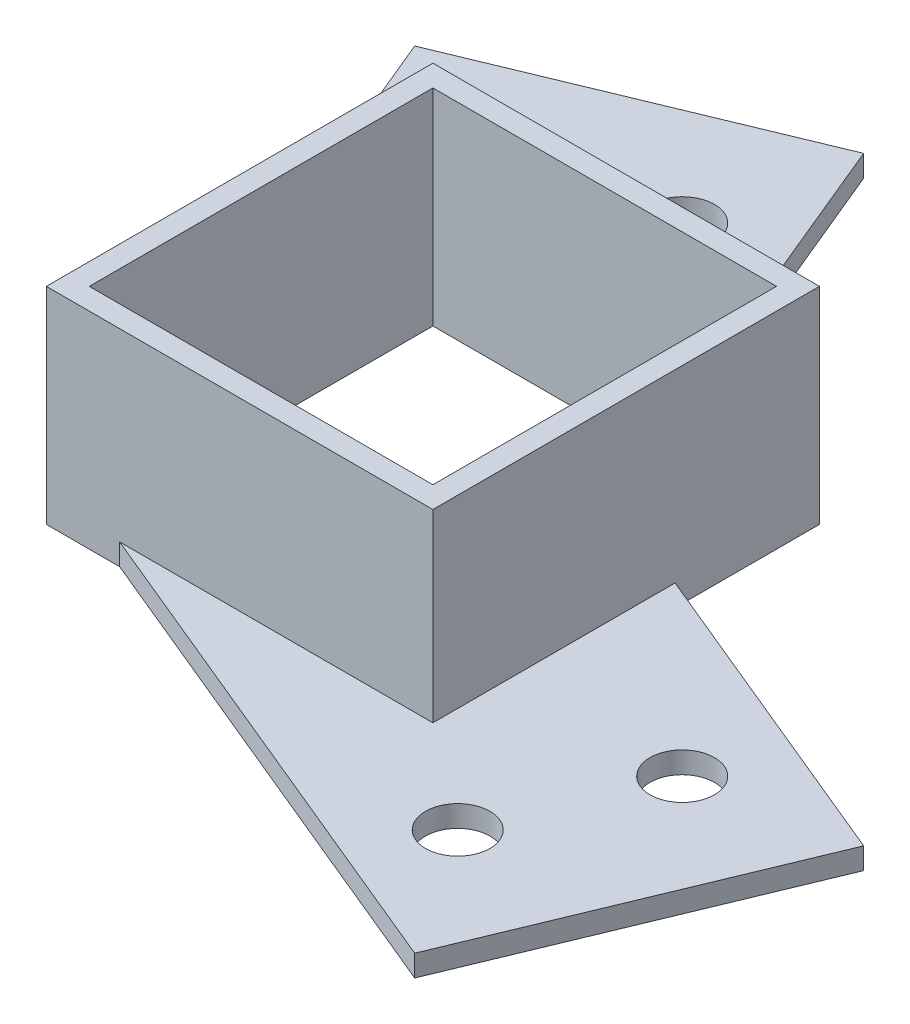
ISO-10303-21;
HEADER;
FILE_DESCRIPTION(('STEP AP214'),'2;1');
FILE_NAME('part.step','',(''),(''),'','','');
FILE_SCHEMA(('AUTOMOTIVE_DESIGN { 1 0 10303 214 1 1 1 1 }'));
ENDSEC;
DATA;
#1=APPLICATION_CONTEXT('core data for automotive mechanical design processes');
#2=APPLICATION_PROTOCOL_DEFINITION('international standard','automotive_design',2000,#1);
#3=PRODUCT_CONTEXT('',#1,'mechanical');
#4=PRODUCT('Part','Part','',(#3));
#5=PRODUCT_RELATED_PRODUCT_CATEGORY('part','',(#4));
#6=PRODUCT_DEFINITION_FORMATION('','',#4);
#7=PRODUCT_DEFINITION_CONTEXT('part definition',#1,'design');
#8=PRODUCT_DEFINITION('design','',#6,#7);
#9=PRODUCT_DEFINITION_SHAPE('','',#8);
#10=(LENGTH_UNIT() NAMED_UNIT(*) SI_UNIT(.MILLI.,.METRE.));
#11=(NAMED_UNIT(*) PLANE_ANGLE_UNIT() SI_UNIT($,.RADIAN.));
#12=(NAMED_UNIT(*) SI_UNIT($,.STERADIAN.) SOLID_ANGLE_UNIT());
#13=UNCERTAINTY_MEASURE_WITH_UNIT(LENGTH_MEASURE(1.E-05),#10,'distance_accuracy_value','');
#14=(GEOMETRIC_REPRESENTATION_CONTEXT(3) GLOBAL_UNCERTAINTY_ASSIGNED_CONTEXT((#13)) GLOBAL_UNIT_ASSIGNED_CONTEXT((#10,
#11,#12)) REPRESENTATION_CONTEXT('',''));
#15=CARTESIAN_POINT('',(0.,0.,0.));
#16=DIRECTION('',(0.,0.,1.));
#17=DIRECTION('',(1.,0.,0.));
#18=AXIS2_PLACEMENT_3D('',#15,#16,#17);
#19=CARTESIAN_POINT('',(0.,15.24,-14.2875));
#20=DIRECTION('',(0.,0.,-1.));
#21=DIRECTION('',(-1.,0.,0.));
#22=AXIS2_PLACEMENT_3D('',#19,#20,#21);
#23=PLANE('',#22);
#24=DIRECTION('',(1.,0.,0.));
#25=VECTOR('',#24,1.);
#26=CARTESIAN_POINT('',(0.,0.,-14.2875));
#27=LINE('',#26,#25);
#28=CARTESIAN_POINT('',(3.61417337288288,0.,-14.2875));
#29=VERTEX_POINT('',#28);
#30=CARTESIAN_POINT('',(14.2875,0.,-14.2875));
#31=VERTEX_POINT('',#30);
#32=EDGE_CURVE('E304',#29,#31,#27,.T.);
#33=ORIENTED_EDGE('',*,*,#32,.F.);
#34=DIRECTION('',(0.,-1.,0.));
#35=VECTOR('',#34,1.);
#36=CARTESIAN_POINT('',(3.61417337288288,1.5875,-14.2875));
#37=LINE('',#36,#35);
#38=CARTESIAN_POINT('',(3.61417337288288,1.5875,-14.2875));
#39=VERTEX_POINT('',#38);
#40=EDGE_CURVE('E218',#39,#29,#37,.T.);
#41=ORIENTED_EDGE('',*,*,#40,.F.);
#42=DIRECTION('',(1.,0.,0.));
#43=VECTOR('',#42,1.);
#44=CARTESIAN_POINT('',(0.,1.5875,-14.2875));
#45=LINE('',#44,#43);
#46=CARTESIAN_POINT('',(-14.2875,1.5875,-14.2875));
#47=VERTEX_POINT('',#46);
#48=EDGE_CURVE('E192',#47,#39,#45,.T.);
#49=ORIENTED_EDGE('',*,*,#48,.F.);
#50=DIRECTION('',(0.,-1.,0.));
#51=VECTOR('',#50,1.);
#52=CARTESIAN_POINT('',(-14.2875,15.24,-14.2875));
#53=LINE('',#52,#51);
#54=CARTESIAN_POINT('',(-14.2875,15.24,-14.2875));
#55=VERTEX_POINT('',#54);
#56=EDGE_CURVE('E327',#55,#47,#53,.T.);
#57=ORIENTED_EDGE('',*,*,#56,.F.);
#58=DIRECTION('',(1.,0.,0.));
#59=VECTOR('',#58,1.);
#60=CARTESIAN_POINT('',(0.,15.24,-14.2875));
#61=LINE('',#60,#59);
#62=CARTESIAN_POINT('',(14.2875,15.24,-14.2875));
#63=VERTEX_POINT('',#62);
#64=EDGE_CURVE('E282',#55,#63,#61,.T.);
#65=ORIENTED_EDGE('',*,*,#64,.T.);
#66=DIRECTION('',(0.,-1.,0.));
#67=VECTOR('',#66,1.);
#68=CARTESIAN_POINT('',(14.2875,15.24,-14.2875));
#69=LINE('',#68,#67);
#70=EDGE_CURVE('E329',#63,#31,#69,.T.);
#71=ORIENTED_EDGE('',*,*,#70,.T.);
#72=EDGE_LOOP('',(#33,#41,#49,#57,#65,#71));
#73=FACE_BOUND('',#72,.T.);
#74=ADVANCED_FACE('F68',(#73),#23,.T.);
#75=CARTESIAN_POINT('',(0.,15.24,14.2875));
#76=DIRECTION('',(0.,0.,-1.));
#77=DIRECTION('',(-1.,0.,0.));
#78=AXIS2_PLACEMENT_3D('',#75,#76,#77);
#79=PLANE('',#78);
#80=DIRECTION('',(0.,-1.,0.));
#81=VECTOR('',#80,1.);
#82=CARTESIAN_POINT('',(-8.86743596973272,1.5875,14.2875));
#83=LINE('',#82,#81);
#84=CARTESIAN_POINT('',(-8.86743596973272,1.5875,14.2875));
#85=VERTEX_POINT('',#84);
#86=CARTESIAN_POINT('',(-8.86743596973272,0.,14.2875));
#87=VERTEX_POINT('',#86);
#88=EDGE_CURVE('E93',#85,#87,#83,.T.);
#89=ORIENTED_EDGE('',*,*,#88,.F.);
#90=DIRECTION('',(1.,0.,0.));
#91=VECTOR('',#90,1.);
#92=CARTESIAN_POINT('',(0.,1.5875,14.2875));
#93=LINE('',#92,#91);
#94=CARTESIAN_POINT('',(14.2875,1.5875,14.2875));
#95=VERTEX_POINT('',#94);
#96=EDGE_CURVE('E241',#85,#95,#93,.T.);
#97=ORIENTED_EDGE('',*,*,#96,.T.);
#98=DIRECTION('',(0.,-1.,0.));
#99=VECTOR('',#98,1.);
#100=CARTESIAN_POINT('',(14.2875,15.24,14.2875));
#101=LINE('',#100,#99);
#102=CARTESIAN_POINT('',(14.2875,15.24,14.2875));
#103=VERTEX_POINT('',#102);
#104=EDGE_CURVE('E72',#103,#95,#101,.T.);
#105=ORIENTED_EDGE('',*,*,#104,.F.);
#106=DIRECTION('',(1.,0.,0.));
#107=VECTOR('',#106,1.);
#108=CARTESIAN_POINT('',(0.,15.24,14.2875));
#109=LINE('',#108,#107);
#110=CARTESIAN_POINT('',(-14.2875,15.24,14.2875));
#111=VERTEX_POINT('',#110);
#112=EDGE_CURVE('E276',#111,#103,#109,.T.);
#113=ORIENTED_EDGE('',*,*,#112,.F.);
#114=DIRECTION('',(0.,-1.,0.));
#115=VECTOR('',#114,1.);
#116=CARTESIAN_POINT('',(-14.2875,15.24,14.2875));
#117=LINE('',#116,#115);
#118=CARTESIAN_POINT('',(-14.2875,0.,14.2875));
#119=VERTEX_POINT('',#118);
#120=EDGE_CURVE('E299',#111,#119,#117,.T.);
#121=ORIENTED_EDGE('',*,*,#120,.T.);
#122=DIRECTION('',(1.,0.,0.));
#123=VECTOR('',#122,1.);
#124=CARTESIAN_POINT('',(0.,0.,14.2875));
#125=LINE('',#124,#123);
#126=EDGE_CURVE('E275',#119,#87,#125,.T.);
#127=ORIENTED_EDGE('',*,*,#126,.T.);
#128=EDGE_LOOP('',(#89,#97,#105,#113,#121,#127));
#129=FACE_BOUND('',#128,.T.);
#130=ADVANCED_FACE('F70',(#129),#79,.F.);
#131=CARTESIAN_POINT('',(12.7,15.24,0.));
#132=DIRECTION('',(-1.,0.,0.));
#133=DIRECTION('',(0.,0.,1.));
#134=AXIS2_PLACEMENT_3D('',#131,#132,#133);
#135=PLANE('',#134);
#136=DIRECTION('',(0.,0.,-1.));
#137=VECTOR('',#136,1.);
#138=CARTESIAN_POINT('',(12.7,0.,0.));
#139=LINE('',#138,#137);
#140=CARTESIAN_POINT('',(12.7,0.,12.7));
#141=VERTEX_POINT('',#140);
#142=CARTESIAN_POINT('',(12.7,0.,-12.7));
#143=VERTEX_POINT('',#142);
#144=EDGE_CURVE('E309',#141,#143,#139,.T.);
#145=ORIENTED_EDGE('',*,*,#144,.F.);
#146=DIRECTION('',(0.,-1.,0.));
#147=VECTOR('',#146,1.);
#148=CARTESIAN_POINT('',(12.7,15.24,12.7));
#149=LINE('',#148,#147);
#150=CARTESIAN_POINT('',(12.7,15.24,12.7));
#151=VERTEX_POINT('',#150);
#152=EDGE_CURVE('E12',#151,#141,#149,.T.);
#153=ORIENTED_EDGE('',*,*,#152,.F.);
#154=DIRECTION('',(0.,0.,-1.));
#155=VECTOR('',#154,1.);
#156=CARTESIAN_POINT('',(12.7,15.24,0.));
#157=LINE('',#156,#155);
#158=CARTESIAN_POINT('',(12.7,15.24,-12.7));
#159=VERTEX_POINT('',#158);
#160=EDGE_CURVE('E288',#151,#159,#157,.T.);
#161=ORIENTED_EDGE('',*,*,#160,.T.);
#162=DIRECTION('',(0.,-1.,0.));
#163=VECTOR('',#162,1.);
#164=CARTESIAN_POINT('',(12.7,15.24,-12.7));
#165=LINE('',#164,#163);
#166=EDGE_CURVE('E320',#159,#143,#165,.T.);
#167=ORIENTED_EDGE('',*,*,#166,.T.);
#168=EDGE_LOOP('',(#145,#153,#161,#167));
#169=FACE_BOUND('',#168,.T.);
#170=ADVANCED_FACE('F382',(#169),#135,.T.);
#171=CARTESIAN_POINT('',(0.,15.24,12.7));
#172=DIRECTION('',(0.,0.,-1.));
#173=DIRECTION('',(-1.,0.,0.));
#174=AXIS2_PLACEMENT_3D('',#171,#172,#173);
#175=PLANE('',#174);
#176=DIRECTION('',(1.,0.,0.));
#177=VECTOR('',#176,1.);
#178=CARTESIAN_POINT('',(0.,0.,12.7));
#179=LINE('',#178,#177);
#180=CARTESIAN_POINT('',(-12.7,0.,12.7));
#181=VERTEX_POINT('',#180);
#182=EDGE_CURVE('E312',#181,#141,#179,.T.);
#183=ORIENTED_EDGE('',*,*,#182,.F.);
#184=DIRECTION('',(0.,-1.,0.));
#185=VECTOR('',#184,1.);
#186=CARTESIAN_POINT('',(-12.7,15.24,12.7));
#187=LINE('',#186,#185);
#188=CARTESIAN_POINT('',(-12.7,15.24,12.7));
#189=VERTEX_POINT('',#188);
#190=EDGE_CURVE('E77',#189,#181,#187,.T.);
#191=ORIENTED_EDGE('',*,*,#190,.F.);
#192=DIRECTION('',(1.,0.,0.));
#193=VECTOR('',#192,1.);
#194=CARTESIAN_POINT('',(0.,15.24,12.7));
#195=LINE('',#194,#193);
#196=EDGE_CURVE('E291',#189,#151,#195,.T.);
#197=ORIENTED_EDGE('',*,*,#196,.T.);
#198=ORIENTED_EDGE('',*,*,#152,.T.);
#199=EDGE_LOOP('',(#183,#191,#197,#198));
#200=FACE_BOUND('',#199,.T.);
#201=ADVANCED_FACE('F392',(#200),#175,.T.);
#202=CARTESIAN_POINT('',(-12.7,15.24,0.));
#203=DIRECTION('',(-1.,0.,0.));
#204=DIRECTION('',(0.,0.,1.));
#205=AXIS2_PLACEMENT_3D('',#202,#203,#204);
#206=PLANE('',#205);
#207=DIRECTION('',(0.,0.,-1.));
#208=VECTOR('',#207,1.);
#209=CARTESIAN_POINT('',(-12.7,0.,0.));
#210=LINE('',#209,#208);
#211=CARTESIAN_POINT('',(-12.7,0.,-12.7));
#212=VERTEX_POINT('',#211);
#213=EDGE_CURVE('E315',#181,#212,#210,.T.);
#214=ORIENTED_EDGE('',*,*,#213,.T.);
#215=DIRECTION('',(0.,-1.,0.));
#216=VECTOR('',#215,1.);
#217=CARTESIAN_POINT('',(-12.7,15.24,-12.7));
#218=LINE('',#217,#216);
#219=CARTESIAN_POINT('',(-12.7,15.24,-12.7));
#220=VERTEX_POINT('',#219);
#221=EDGE_CURVE('E322',#220,#212,#218,.T.);
#222=ORIENTED_EDGE('',*,*,#221,.F.);
#223=DIRECTION('',(0.,0.,-1.));
#224=VECTOR('',#223,1.);
#225=CARTESIAN_POINT('',(-12.7,15.24,0.));
#226=LINE('',#225,#224);
#227=EDGE_CURVE('E294',#189,#220,#226,.T.);
#228=ORIENTED_EDGE('',*,*,#227,.F.);
#229=ORIENTED_EDGE('',*,*,#190,.T.);
#230=EDGE_LOOP('',(#214,#222,#228,#229));
#231=FACE_BOUND('',#230,.T.);
#232=ADVANCED_FACE('F386',(#231),#206,.F.);
#233=CARTESIAN_POINT('',(14.2875,15.24,0.));
#234=DIRECTION('',(-1.,0.,0.));
#235=DIRECTION('',(0.,0.,1.));
#236=AXIS2_PLACEMENT_3D('',#233,#234,#235);
#237=PLANE('',#236);
#238=DIRECTION('',(0.,0.,-1.));
#239=VECTOR('',#238,1.);
#240=CARTESIAN_POINT('',(14.2875,1.5875,0.));
#241=LINE('',#240,#239);
#242=CARTESIAN_POINT('',(14.2875,1.5875,-3.61417337288289));
#243=VERTEX_POINT('',#242);
#244=EDGE_CURVE('E238',#95,#243,#241,.T.);
#245=ORIENTED_EDGE('',*,*,#244,.T.);
#246=DIRECTION('',(0.,-1.,0.));
#247=VECTOR('',#246,1.);
#248=CARTESIAN_POINT('',(14.2875,1.5875,-3.61417337288289));
#249=LINE('',#248,#247);
#250=CARTESIAN_POINT('',(14.2875,0.,-3.61417337288289));
#251=VERTEX_POINT('',#250);
#252=EDGE_CURVE('E254',#243,#251,#249,.T.);
#253=ORIENTED_EDGE('',*,*,#252,.T.);
#254=DIRECTION('',(0.,0.,-1.));
#255=VECTOR('',#254,1.);
#256=CARTESIAN_POINT('',(14.2875,0.,0.));
#257=LINE('',#256,#255);
#258=EDGE_CURVE('E301',#251,#31,#257,.T.);
#259=ORIENTED_EDGE('',*,*,#258,.T.);
#260=ORIENTED_EDGE('',*,*,#70,.F.);
#261=DIRECTION('',(0.,0.,-1.));
#262=VECTOR('',#261,1.);
#263=CARTESIAN_POINT('',(14.2875,15.24,0.));
#264=LINE('',#263,#262);
#265=EDGE_CURVE('E279',#103,#63,#264,.T.);
#266=ORIENTED_EDGE('',*,*,#265,.F.);
#267=ORIENTED_EDGE('',*,*,#104,.T.);
#268=EDGE_LOOP('',(#245,#253,#259,#260,#266,#267));
#269=FACE_BOUND('',#268,.T.);
#270=ADVANCED_FACE('F338',(#269),#237,.F.);
#271=CARTESIAN_POINT('',(-14.2875,15.24,0.));
#272=DIRECTION('',(-1.,0.,0.));
#273=DIRECTION('',(0.,0.,1.));
#274=AXIS2_PLACEMENT_3D('',#271,#272,#273);
#275=PLANE('',#274);
#276=DIRECTION('',(0.,-1.,0.));
#277=VECTOR('',#276,1.);
#278=CARTESIAN_POINT('',(-14.2875,1.5875,8.86743596973272));
#279=LINE('',#278,#277);
#280=CARTESIAN_POINT('',(-14.2875,1.5875,8.86743596973272));
#281=VERTEX_POINT('',#280);
#282=CARTESIAN_POINT('',(-14.2875,0.,8.86743596973272));
#283=VERTEX_POINT('',#282);
#284=EDGE_CURVE('E231',#281,#283,#279,.T.);
#285=ORIENTED_EDGE('',*,*,#284,.T.);
#286=DIRECTION('',(0.,0.,-1.));
#287=VECTOR('',#286,1.);
#288=CARTESIAN_POINT('',(-14.2875,0.,0.));
#289=LINE('',#288,#287);
#290=EDGE_CURVE('E306',#119,#283,#289,.T.);
#291=ORIENTED_EDGE('',*,*,#290,.F.);
#292=ORIENTED_EDGE('',*,*,#120,.F.);
#293=DIRECTION('',(0.,0.,-1.));
#294=VECTOR('',#293,1.);
#295=CARTESIAN_POINT('',(-14.2875,15.24,0.));
#296=LINE('',#295,#294);
#297=EDGE_CURVE('E285',#111,#55,#296,.T.);
#298=ORIENTED_EDGE('',*,*,#297,.T.);
#299=ORIENTED_EDGE('',*,*,#56,.T.);
#300=DIRECTION('',(0.,0.,-1.));
#301=VECTOR('',#300,1.);
#302=CARTESIAN_POINT('',(-14.2875,1.5875,0.));
#303=LINE('',#302,#301);
#304=EDGE_CURVE('E207',#281,#47,#303,.T.);
#305=ORIENTED_EDGE('',*,*,#304,.F.);
#306=EDGE_LOOP('',(#285,#291,#292,#298,#299,#305));
#307=FACE_BOUND('',#306,.T.);
#308=ADVANCED_FACE('F356',(#307),#275,.T.);
#309=CARTESIAN_POINT('',(0.,15.24,-12.7));
#310=DIRECTION('',(0.,0.,-1.));
#311=DIRECTION('',(-1.,0.,0.));
#312=AXIS2_PLACEMENT_3D('',#309,#310,#311);
#313=PLANE('',#312);
#314=DIRECTION('',(1.,0.,0.));
#315=VECTOR('',#314,1.);
#316=CARTESIAN_POINT('',(0.,0.,-12.7));
#317=LINE('',#316,#315);
#318=EDGE_CURVE('E280',#212,#143,#317,.T.);
#319=ORIENTED_EDGE('',*,*,#318,.T.);
#320=ORIENTED_EDGE('',*,*,#166,.F.);
#321=DIRECTION('',(1.,0.,0.));
#322=VECTOR('',#321,1.);
#323=CARTESIAN_POINT('',(0.,15.24,-12.7));
#324=LINE('',#323,#322);
#325=EDGE_CURVE('E297',#220,#159,#324,.T.);
#326=ORIENTED_EDGE('',*,*,#325,.F.);
#327=ORIENTED_EDGE('',*,*,#221,.T.);
#328=EDGE_LOOP('',(#319,#320,#326,#327));
#329=FACE_BOUND('',#328,.T.);
#330=ADVANCED_FACE('F391',(#329),#313,.F.);
#331=CARTESIAN_POINT('',(0.,15.24,0.));
#332=DIRECTION('',(0.,1.,0.));
#333=DIRECTION('',(0.,0.,1.));
#334=AXIS2_PLACEMENT_3D('',#331,#332,#333);
#335=PLANE('',#334);
#336=ORIENTED_EDGE('',*,*,#112,.T.);
#337=ORIENTED_EDGE('',*,*,#265,.T.);
#338=ORIENTED_EDGE('',*,*,#64,.F.);
#339=ORIENTED_EDGE('',*,*,#297,.F.);
#340=EDGE_LOOP('',(#336,#337,#338,#339));
#341=FACE_BOUND('',#340,.T.);
#342=ORIENTED_EDGE('',*,*,#160,.F.);
#343=ORIENTED_EDGE('',*,*,#196,.F.);
#344=ORIENTED_EDGE('',*,*,#227,.T.);
#345=ORIENTED_EDGE('',*,*,#325,.T.);
#346=EDGE_LOOP('',(#342,#343,#344,#345));
#347=FACE_BOUND('',#346,.T.);
#348=ADVANCED_FACE('F360',(#341,#347),#335,.T.);
#349=CARTESIAN_POINT('',(0.,0.,0.));
#350=DIRECTION('',(0.,1.,0.));
#351=DIRECTION('',(0.,0.,1.));
#352=AXIS2_PLACEMENT_3D('',#349,#350,#351);
#353=PLANE('',#352);
#354=ORIENTED_EDGE('',*,*,#258,.F.);
#355=DIRECTION('',(0.923879532511286,0.,0.382683432365091));
#356=VECTOR('',#355,1.);
#357=CARTESIAN_POINT('',(3.37015918207329,0.,-8.13628400471753));
#358=LINE('',#357,#356);
#359=CARTESIAN_POINT('',(38.0866044022,0.,6.2437384428416));
#360=VERTEX_POINT('',#359);
#361=EDGE_CURVE('E263',#251,#360,#358,.T.);
#362=ORIENTED_EDGE('',*,*,#361,.T.);
#363=DIRECTION('',(0.382683432365091,0.,-0.923879532511286));
#364=VECTOR('',#363,1.);
#365=CARTESIAN_POINT('',(34.7164452201267,0.,14.3800224475591));
#366=LINE('',#365,#364);
#367=CARTESIAN_POINT('',(28.3664452201267,0.,29.7102785686283));
#368=VERTEX_POINT('',#367);
#369=EDGE_CURVE('E260',#368,#360,#366,.T.);
#370=ORIENTED_EDGE('',*,*,#369,.F.);
#371=DIRECTION('',(0.923879532511287,0.,0.382683432365091));
#372=VECTOR('',#371,1.);
#373=CARTESIAN_POINT('',(-6.35000000000002,0.,15.3302561210692));
#374=LINE('',#373,#372);
#375=EDGE_CURVE('E257',#87,#368,#374,.T.);
#376=ORIENTED_EDGE('',*,*,#375,.F.);
#377=ORIENTED_EDGE('',*,*,#126,.F.);
#378=ORIENTED_EDGE('',*,*,#290,.T.);
#379=DIRECTION('',(-0.382683432365091,0.,-0.923879532511286));
#380=VECTOR('',#379,1.);
#381=CARTESIAN_POINT('',(-15.3302561210692,0.,6.35000000000002));
#382=LINE('',#381,#380);
#383=CARTESIAN_POINT('',(-29.7102785686283,0.,-28.3664452201267));
#384=VERTEX_POINT('',#383);
#385=EDGE_CURVE('E222',#283,#384,#382,.T.);
#386=ORIENTED_EDGE('',*,*,#385,.T.);
#387=DIRECTION('',(0.923879532511286,0.,-0.382683432365091));
#388=VECTOR('',#387,1.);
#389=CARTESIAN_POINT('',(-14.3800224475591,0.,-34.7164452201267));
#390=LINE('',#389,#388);
#391=CARTESIAN_POINT('',(-6.24373844284163,0.,-38.0866044022));
#392=VERTEX_POINT('',#391);
#393=EDGE_CURVE('E220',#384,#392,#390,.T.);
#394=ORIENTED_EDGE('',*,*,#393,.T.);
#395=DIRECTION('',(-0.382683432365091,0.,-0.923879532511286));
#396=VECTOR('',#395,1.);
#397=CARTESIAN_POINT('',(8.13628400471752,0.,-3.37015918207329));
#398=LINE('',#397,#396);
#399=EDGE_CURVE('E85',#29,#392,#398,.T.);
#400=ORIENTED_EDGE('',*,*,#399,.F.);
#401=ORIENTED_EDGE('',*,*,#32,.T.);
#402=EDGE_LOOP('',(#354,#362,#370,#376,#377,#378,#386,#394,#400,#401));
#403=FACE_BOUND('',#402,.T.);
#404=ORIENTED_EDGE('',*,*,#144,.T.);
#405=ORIENTED_EDGE('',*,*,#318,.F.);
#406=ORIENTED_EDGE('',*,*,#213,.F.);
#407=ORIENTED_EDGE('',*,*,#182,.T.);
#408=EDGE_LOOP('',(#404,#405,#406,#407));
#409=FACE_BOUND('',#408,.T.);
#410=CARTESIAN_POINT('',(22.061531473683,0.,20.2255073134021));
#411=DIRECTION('',(0.,1.,0.));
#412=DIRECTION('',(0.,0.,1.));
#413=AXIS2_PLACEMENT_3D('',#410,#411,#412);
#414=CIRCLE('',#413,2.38125);
#415=CARTESIAN_POINT('',(22.061531473683,0.,22.6067573134021));
#416=VERTEX_POINT('',#415);
#417=EDGE_CURVE('E201',#416,#416,#414,.F.);
#418=ORIENTED_EDGE('',*,*,#417,.F.);
#419=EDGE_LOOP('',(#418));
#420=FACE_BOUND('',#419,.T.);
#421=CARTESIAN_POINT('',(26.9216110647197,0.,8.49223725050873));
#422=DIRECTION('',(0.,1.,0.));
#423=DIRECTION('',(0.,0.,1.));
#424=AXIS2_PLACEMENT_3D('',#421,#422,#423);
#425=CIRCLE('',#424,2.38125);
#426=CARTESIAN_POINT('',(26.9216110647197,0.,10.8734872505087));
#427=VERTEX_POINT('',#426);
#428=EDGE_CURVE('E239',#427,#427,#425,.F.);
#429=ORIENTED_EDGE('',*,*,#428,.F.);
#430=EDGE_LOOP('',(#429));
#431=FACE_BOUND('',#430,.T.);
#432=CARTESIAN_POINT('',(-8.49223725050873,0.,-26.9216110647197));
#433=DIRECTION('',(0.,1.,0.));
#434=DIRECTION('',(0.,0.,1.));
#435=AXIS2_PLACEMENT_3D('',#432,#433,#434);
#436=CIRCLE('',#435,2.38125);
#437=CARTESIAN_POINT('',(-8.49223725050873,0.,-24.5403610647197));
#438=VERTEX_POINT('',#437);
#439=EDGE_CURVE('E225',#438,#438,#436,.T.);
#440=ORIENTED_EDGE('',*,*,#439,.T.);
#441=EDGE_LOOP('',(#440));
#442=FACE_BOUND('',#441,.T.);
#443=CARTESIAN_POINT('',(-20.2255073134021,0.,-22.0615314736831));
#444=DIRECTION('',(0.,1.,0.));
#445=DIRECTION('',(0.,0.,1.));
#446=AXIS2_PLACEMENT_3D('',#443,#444,#445);
#447=CIRCLE('',#446,2.38125);
#448=CARTESIAN_POINT('',(-20.2255073134021,0.,-19.680281473683));
#449=VERTEX_POINT('',#448);
#450=EDGE_CURVE('E195',#449,#449,#447,.T.);
#451=ORIENTED_EDGE('',*,*,#450,.T.);
#452=EDGE_LOOP('',(#451));
#453=FACE_BOUND('',#452,.T.);
#454=ADVANCED_FACE('F351',(#403,#409,#420,#431,#442,#453),#353,.F.);
#455=CARTESIAN_POINT('',(-6.35000000000002,1.5875,15.3302561210692));
#456=DIRECTION('',(0.382683432365091,0.,-0.923879532511287));
#457=DIRECTION('',(-0.923879532511287,0.,-0.382683432365091));
#458=AXIS2_PLACEMENT_3D('',#455,#456,#457);
#459=PLANE('',#458);
#460=ORIENTED_EDGE('',*,*,#375,.T.);
#461=DIRECTION('',(0.,-1.,0.));
#462=VECTOR('',#461,1.);
#463=CARTESIAN_POINT('',(28.3664452201267,1.5875,29.7102785686283));
#464=LINE('',#463,#462);
#465=CARTESIAN_POINT('',(28.3664452201267,1.5875,29.7102785686283));
#466=VERTEX_POINT('',#465);
#467=EDGE_CURVE('E271',#466,#368,#464,.T.);
#468=ORIENTED_EDGE('',*,*,#467,.F.);
#469=DIRECTION('',(0.923879532511287,0.,0.382683432365091));
#470=VECTOR('',#469,1.);
#471=CARTESIAN_POINT('',(-6.35000000000002,1.5875,15.3302561210692));
#472=LINE('',#471,#470);
#473=EDGE_CURVE('E243',#85,#466,#472,.T.);
#474=ORIENTED_EDGE('',*,*,#473,.F.);
#475=ORIENTED_EDGE('',*,*,#88,.T.);
#476=EDGE_LOOP('',(#460,#468,#474,#475));
#477=FACE_BOUND('',#476,.T.);
#478=ADVANCED_FACE('F424',(#477),#459,.F.);
#479=CARTESIAN_POINT('',(34.7164452201267,1.5875,14.3800224475591));
#480=DIRECTION('',(-0.923879532511286,0.,-0.382683432365091));
#481=DIRECTION('',(-0.382683432365091,0.,0.923879532511286));
#482=AXIS2_PLACEMENT_3D('',#479,#480,#481);
#483=PLANE('',#482);
#484=ORIENTED_EDGE('',*,*,#369,.T.);
#485=DIRECTION('',(0.,-1.,0.));
#486=VECTOR('',#485,1.);
#487=CARTESIAN_POINT('',(38.0866044022,1.5875,6.2437384428416));
#488=LINE('',#487,#486);
#489=CARTESIAN_POINT('',(38.0866044022,1.5875,6.2437384428416));
#490=VERTEX_POINT('',#489);
#491=EDGE_CURVE('E269',#490,#360,#488,.T.);
#492=ORIENTED_EDGE('',*,*,#491,.F.);
#493=DIRECTION('',(0.382683432365091,0.,-0.923879532511286));
#494=VECTOR('',#493,1.);
#495=CARTESIAN_POINT('',(34.7164452201267,1.5875,14.3800224475591));
#496=LINE('',#495,#494);
#497=EDGE_CURVE('E246',#466,#490,#496,.T.);
#498=ORIENTED_EDGE('',*,*,#497,.F.);
#499=ORIENTED_EDGE('',*,*,#467,.T.);
#500=EDGE_LOOP('',(#484,#492,#498,#499));
#501=FACE_BOUND('',#500,.T.);
#502=ADVANCED_FACE('F433',(#501),#483,.F.);
#503=CARTESIAN_POINT('',(3.37015918207329,1.5875,-8.13628400471753));
#504=DIRECTION('',(0.382683432365091,0.,-0.923879532511286));
#505=DIRECTION('',(-0.923879532511286,0.,-0.382683432365091));
#506=AXIS2_PLACEMENT_3D('',#503,#504,#505);
#507=PLANE('',#506);
#508=ORIENTED_EDGE('',*,*,#361,.F.);
#509=ORIENTED_EDGE('',*,*,#252,.F.);
#510=DIRECTION('',(0.923879532511286,0.,0.382683432365091));
#511=VECTOR('',#510,1.);
#512=CARTESIAN_POINT('',(3.37015918207329,1.5875,-8.13628400471753));
#513=LINE('',#512,#511);
#514=EDGE_CURVE('E248',#243,#490,#513,.T.);
#515=ORIENTED_EDGE('',*,*,#514,.T.);
#516=ORIENTED_EDGE('',*,*,#491,.T.);
#517=EDGE_LOOP('',(#508,#509,#515,#516));
#518=FACE_BOUND('',#517,.T.);
#519=ADVANCED_FACE('F349',(#518),#507,.T.);
#520=CARTESIAN_POINT('',(22.061531473683,1.5875,20.2255073134021));
#521=DIRECTION('',(0.,-1.,0.));
#522=DIRECTION('',(0.,0.,-1.));
#523=AXIS2_PLACEMENT_3D('',#520,#521,#522);
#524=CYLINDRICAL_SURFACE('',#523,2.38125);
#525=CARTESIAN_POINT('',(22.061531473683,1.5875,20.2255073134021));
#526=DIRECTION('',(0.,1.,0.));
#527=DIRECTION('',(0.,0.,1.));
#528=AXIS2_PLACEMENT_3D('',#525,#526,#527);
#529=CIRCLE('',#528,2.38125);
#530=CARTESIAN_POINT('',(22.061531473683,1.5875,22.6067573134021));
#531=VERTEX_POINT('',#530);
#532=EDGE_CURVE('E235',#531,#531,#529,.F.);
#533=ORIENTED_EDGE('',*,*,#532,.F.);
#534=EDGE_LOOP('',(#533));
#535=FACE_BOUND('',#534,.T.);
#536=ORIENTED_EDGE('',*,*,#417,.T.);
#537=EDGE_LOOP('',(#536));
#538=FACE_BOUND('',#537,.T.);
#539=ADVANCED_FACE('F426',(#535,#538),#524,.F.);
#540=CARTESIAN_POINT('',(26.9216110647197,1.5875,8.49223725050873));
#541=DIRECTION('',(0.,-1.,0.));
#542=DIRECTION('',(0.,0.,-1.));
#543=AXIS2_PLACEMENT_3D('',#540,#541,#542);
#544=CYLINDRICAL_SURFACE('',#543,2.38125);
#545=CARTESIAN_POINT('',(26.9216110647197,1.5875,8.49223725050873));
#546=DIRECTION('',(0.,1.,0.));
#547=DIRECTION('',(0.,0.,1.));
#548=AXIS2_PLACEMENT_3D('',#545,#546,#547);
#549=CIRCLE('',#548,2.38125);
#550=CARTESIAN_POINT('',(26.9216110647197,1.5875,10.8734872505087));
#551=VERTEX_POINT('',#550);
#552=EDGE_CURVE('E251',#551,#551,#549,.F.);
#553=ORIENTED_EDGE('',*,*,#552,.F.);
#554=EDGE_LOOP('',(#553));
#555=FACE_BOUND('',#554,.T.);
#556=ORIENTED_EDGE('',*,*,#428,.T.);
#557=EDGE_LOOP('',(#556));
#558=FACE_BOUND('',#557,.T.);
#559=ADVANCED_FACE('F429',(#555,#558),#544,.F.);
#560=CARTESIAN_POINT('',(0.,1.5875,0.));
#561=DIRECTION('',(0.,1.,0.));
#562=DIRECTION('',(0.,0.,1.));
#563=AXIS2_PLACEMENT_3D('',#560,#561,#562);
#564=PLANE('',#563);
#565=ORIENTED_EDGE('',*,*,#532,.T.);
#566=EDGE_LOOP('',(#565));
#567=FACE_BOUND('',#566,.T.);
#568=ORIENTED_EDGE('',*,*,#244,.F.);
#569=ORIENTED_EDGE('',*,*,#96,.F.);
#570=ORIENTED_EDGE('',*,*,#473,.T.);
#571=ORIENTED_EDGE('',*,*,#497,.T.);
#572=ORIENTED_EDGE('',*,*,#514,.F.);
#573=EDGE_LOOP('',(#568,#569,#570,#571,#572));
#574=FACE_BOUND('',#573,.T.);
#575=ORIENTED_EDGE('',*,*,#552,.T.);
#576=EDGE_LOOP('',(#575));
#577=FACE_BOUND('',#576,.T.);
#578=ADVANCED_FACE('F344',(#567,#574,#577),#564,.T.);
#579=CARTESIAN_POINT('',(8.13628400471752,1.5875,-3.37015918207329));
#580=DIRECTION('',(-0.923879532511286,0.,0.382683432365091));
#581=DIRECTION('',(0.382683432365091,0.,0.923879532511286));
#582=AXIS2_PLACEMENT_3D('',#579,#580,#581);
#583=PLANE('',#582);
#584=ORIENTED_EDGE('',*,*,#399,.T.);
#585=DIRECTION('',(0.,-1.,0.));
#586=VECTOR('',#585,1.);
#587=CARTESIAN_POINT('',(-6.24373844284163,1.5875,-38.0866044022));
#588=LINE('',#587,#586);
#589=CARTESIAN_POINT('',(-6.24373844284163,1.5875,-38.0866044022));
#590=VERTEX_POINT('',#589);
#591=EDGE_CURVE('E197',#590,#392,#588,.T.);
#592=ORIENTED_EDGE('',*,*,#591,.F.);
#593=DIRECTION('',(-0.382683432365091,0.,-0.923879532511286));
#594=VECTOR('',#593,1.);
#595=CARTESIAN_POINT('',(8.13628400471752,1.5875,-3.37015918207329));
#596=LINE('',#595,#594);
#597=EDGE_CURVE('E183',#39,#590,#596,.T.);
#598=ORIENTED_EDGE('',*,*,#597,.F.);
#599=ORIENTED_EDGE('',*,*,#40,.T.);
#600=EDGE_LOOP('',(#584,#592,#598,#599));
#601=FACE_BOUND('',#600,.T.);
#602=ADVANCED_FACE('F198',(#601),#583,.F.);
#603=CARTESIAN_POINT('',(-14.3800224475591,1.5875,-34.7164452201267));
#604=DIRECTION('',(-0.382683432365091,0.,-0.923879532511286));
#605=DIRECTION('',(-0.923879532511286,0.,0.382683432365091));
#606=AXIS2_PLACEMENT_3D('',#603,#604,#605);
#607=PLANE('',#606);
#608=ORIENTED_EDGE('',*,*,#393,.F.);
#609=DIRECTION('',(0.,-1.,0.));
#610=VECTOR('',#609,1.);
#611=CARTESIAN_POINT('',(-29.7102785686283,1.5875,-28.3664452201267));
#612=LINE('',#611,#610);
#613=CARTESIAN_POINT('',(-29.7102785686283,1.5875,-28.3664452201267));
#614=VERTEX_POINT('',#613);
#615=EDGE_CURVE('E202',#614,#384,#612,.T.);
#616=ORIENTED_EDGE('',*,*,#615,.F.);
#617=DIRECTION('',(0.923879532511286,0.,-0.382683432365091));
#618=VECTOR('',#617,1.);
#619=CARTESIAN_POINT('',(-14.3800224475591,1.5875,-34.7164452201267));
#620=LINE('',#619,#618);
#621=EDGE_CURVE('E189',#614,#590,#620,.T.);
#622=ORIENTED_EDGE('',*,*,#621,.T.);
#623=ORIENTED_EDGE('',*,*,#591,.T.);
#624=EDGE_LOOP('',(#608,#616,#622,#623));
#625=FACE_BOUND('',#624,.T.);
#626=ADVANCED_FACE('F204',(#625),#607,.T.);
#627=CARTESIAN_POINT('',(-15.3302561210692,1.5875,6.35000000000002));
#628=DIRECTION('',(-0.923879532511286,0.,0.382683432365091));
#629=DIRECTION('',(0.382683432365091,0.,0.923879532511286));
#630=AXIS2_PLACEMENT_3D('',#627,#628,#629);
#631=PLANE('',#630);
#632=ORIENTED_EDGE('',*,*,#385,.F.);
#633=ORIENTED_EDGE('',*,*,#284,.F.);
#634=DIRECTION('',(-0.382683432365091,0.,-0.923879532511286));
#635=VECTOR('',#634,1.);
#636=CARTESIAN_POINT('',(-15.3302561210692,1.5875,6.35000000000002));
#637=LINE('',#636,#635);
#638=EDGE_CURVE('E205',#281,#614,#637,.T.);
#639=ORIENTED_EDGE('',*,*,#638,.T.);
#640=ORIENTED_EDGE('',*,*,#615,.T.);
#641=EDGE_LOOP('',(#632,#633,#639,#640));
#642=FACE_BOUND('',#641,.T.);
#643=ADVANCED_FACE('F365',(#642),#631,.T.);
#644=CARTESIAN_POINT('',(-8.49223725050873,1.5875,-26.9216110647197));
#645=DIRECTION('',(0.,-1.,0.));
#646=DIRECTION('',(0.,0.,-1.));
#647=AXIS2_PLACEMENT_3D('',#644,#645,#646);
#648=CYLINDRICAL_SURFACE('',#647,2.38125);
#649=CARTESIAN_POINT('',(-8.49223725050873,1.5875,-26.9216110647197));
#650=DIRECTION('',(0.,1.,0.));
#651=DIRECTION('',(0.,0.,1.));
#652=AXIS2_PLACEMENT_3D('',#649,#650,#651);
#653=CIRCLE('',#652,2.38125);
#654=CARTESIAN_POINT('',(-8.49223725050873,1.5875,-24.5403610647197));
#655=VERTEX_POINT('',#654);
#656=EDGE_CURVE('E212',#655,#655,#653,.T.);
#657=ORIENTED_EDGE('',*,*,#656,.T.);
#658=EDGE_LOOP('',(#657));
#659=FACE_BOUND('',#658,.T.);
#660=ORIENTED_EDGE('',*,*,#439,.F.);
#661=EDGE_LOOP('',(#660));
#662=FACE_BOUND('',#661,.T.);
#663=ADVANCED_FACE('F367',(#659,#662),#648,.F.);
#664=CARTESIAN_POINT('',(-20.2255073134021,1.5875,-22.0615314736831));
#665=DIRECTION('',(0.,-1.,0.));
#666=DIRECTION('',(0.,0.,-1.));
#667=AXIS2_PLACEMENT_3D('',#664,#665,#666);
#668=CYLINDRICAL_SURFACE('',#667,2.38125);
#669=CARTESIAN_POINT('',(-20.2255073134021,1.5875,-22.0615314736831));
#670=DIRECTION('',(0.,1.,0.));
#671=DIRECTION('',(0.,0.,1.));
#672=AXIS2_PLACEMENT_3D('',#669,#670,#671);
#673=CIRCLE('',#672,2.38125);
#674=CARTESIAN_POINT('',(-20.2255073134021,1.5875,-19.680281473683));
#675=VERTEX_POINT('',#674);
#676=EDGE_CURVE('E215',#675,#675,#673,.T.);
#677=ORIENTED_EDGE('',*,*,#676,.T.);
#678=EDGE_LOOP('',(#677));
#679=FACE_BOUND('',#678,.T.);
#680=ORIENTED_EDGE('',*,*,#450,.F.);
#681=EDGE_LOOP('',(#680));
#682=FACE_BOUND('',#681,.T.);
#683=ADVANCED_FACE('F373',(#679,#682),#668,.F.);
#684=CARTESIAN_POINT('',(0.,1.5875,0.));
#685=DIRECTION('',(0.,1.,0.));
#686=DIRECTION('',(0.,0.,1.));
#687=AXIS2_PLACEMENT_3D('',#684,#685,#686);
#688=PLANE('',#687);
#689=ORIENTED_EDGE('',*,*,#597,.T.);
#690=ORIENTED_EDGE('',*,*,#621,.F.);
#691=ORIENTED_EDGE('',*,*,#638,.F.);
#692=ORIENTED_EDGE('',*,*,#304,.T.);
#693=ORIENTED_EDGE('',*,*,#48,.T.);
#694=EDGE_LOOP('',(#689,#690,#691,#692,#693));
#695=FACE_BOUND('',#694,.T.);
#696=ORIENTED_EDGE('',*,*,#656,.F.);
#697=EDGE_LOOP('',(#696));
#698=FACE_BOUND('',#697,.T.);
#699=ORIENTED_EDGE('',*,*,#676,.F.);
#700=EDGE_LOOP('',(#699));
#701=FACE_BOUND('',#700,.T.);
#702=ADVANCED_FACE('F185',(#695,#698,#701),#688,.T.);
#703=CLOSED_SHELL('',(#74,#130,#170,#201,#232,#270,#308,#330,#348,#454,#478,#502,#519,#539,#559,
#578,#602,#626,#643,#663,#683,#702));
#704=MANIFOLD_SOLID_BREP('B2',#703);
#705=ADVANCED_BREP_SHAPE_REPRESENTATION('',(#18,#704),#14);
#706=SHAPE_DEFINITION_REPRESENTATION(#9,#705);
ENDSEC;
END-ISO-10303-21;
